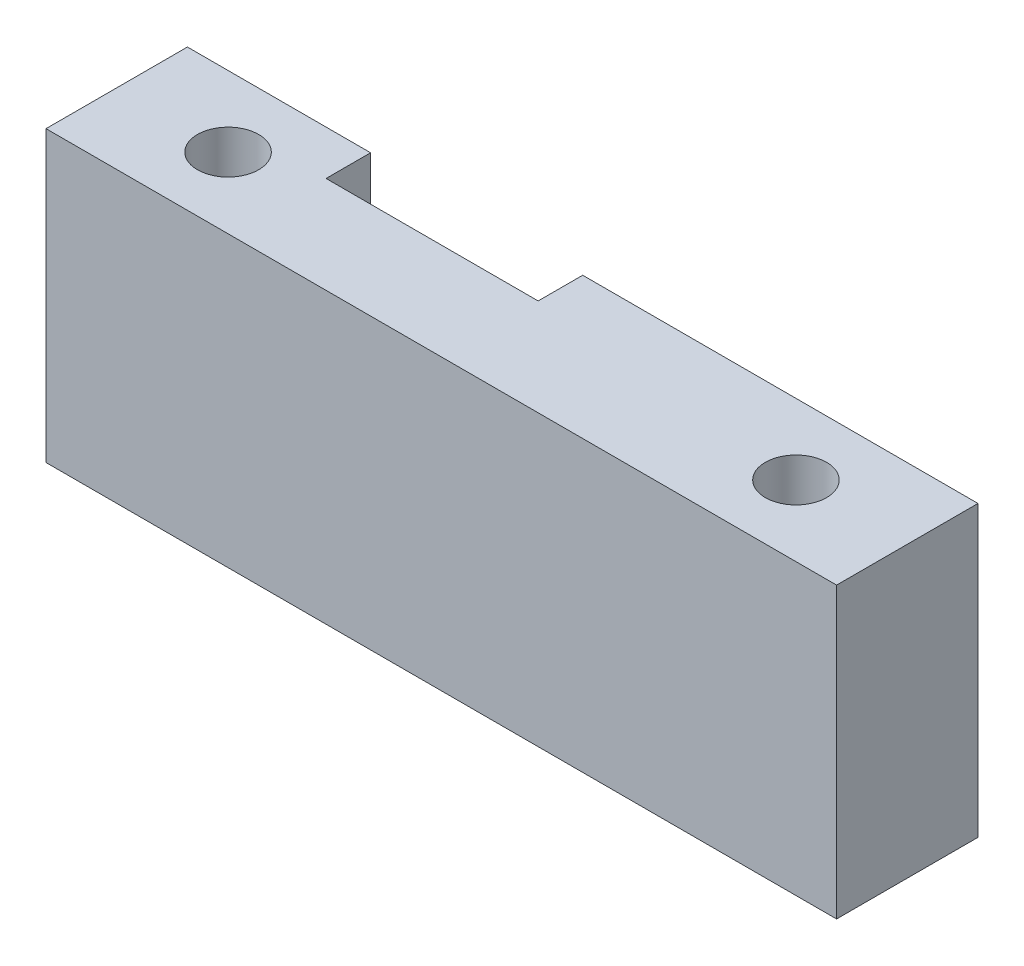
ISO-10303-21;
HEADER;
FILE_DESCRIPTION(('STEP AP214'),'2;1');
FILE_NAME('part.step','',(''),(''),'','','');
FILE_SCHEMA(('AUTOMOTIVE_DESIGN { 1 0 10303 214 1 1 1 1 }'));
ENDSEC;
DATA;
#1=APPLICATION_CONTEXT('core data for automotive mechanical design processes');
#2=APPLICATION_PROTOCOL_DEFINITION('international standard','automotive_design',2000,#1);
#3=PRODUCT_CONTEXT('',#1,'mechanical');
#4=PRODUCT('Part','Part','',(#3));
#5=PRODUCT_RELATED_PRODUCT_CATEGORY('part','',(#4));
#6=PRODUCT_DEFINITION_FORMATION('','',#4);
#7=PRODUCT_DEFINITION_CONTEXT('part definition',#1,'design');
#8=PRODUCT_DEFINITION('design','',#6,#7);
#9=PRODUCT_DEFINITION_SHAPE('','',#8);
#10=(LENGTH_UNIT() NAMED_UNIT(*) SI_UNIT(.MILLI.,.METRE.));
#11=(NAMED_UNIT(*) PLANE_ANGLE_UNIT() SI_UNIT($,.RADIAN.));
#12=(NAMED_UNIT(*) SI_UNIT($,.STERADIAN.) SOLID_ANGLE_UNIT());
#13=UNCERTAINTY_MEASURE_WITH_UNIT(LENGTH_MEASURE(1.E-05),#10,'distance_accuracy_value','');
#14=(GEOMETRIC_REPRESENTATION_CONTEXT(3) GLOBAL_UNCERTAINTY_ASSIGNED_CONTEXT((#13)) GLOBAL_UNIT_ASSIGNED_CONTEXT((#10,
#11,#12)) REPRESENTATION_CONTEXT('',''));
#15=CARTESIAN_POINT('',(0.,0.,0.));
#16=DIRECTION('',(0.,0.,1.));
#17=DIRECTION('',(1.,0.,0.));
#18=AXIS2_PLACEMENT_3D('',#15,#16,#17);
#19=CARTESIAN_POINT('',(-10.,25.97,-6.35));
#20=DIRECTION('',(0.,0.,1.));
#21=DIRECTION('',(1.,0.,0.));
#22=AXIS2_PLACEMENT_3D('',#19,#20,#21);
#23=PLANE('',#22);
#24=DIRECTION('',(-1.,0.,0.));
#25=VECTOR('',#24,1.);
#26=CARTESIAN_POINT('',(-10.,25.97,-6.35));
#27=LINE('',#26,#25);
#28=CARTESIAN_POINT('',(6.45,25.97,-6.35));
#29=VERTEX_POINT('',#28);
#30=CARTESIAN_POINT('',(-10.,25.97,-6.35));
#31=VERTEX_POINT('',#30);
#32=EDGE_CURVE('E71',#29,#31,#27,.T.);
#33=ORIENTED_EDGE('',*,*,#32,.F.);
#34=DIRECTION('',(0.,1.,0.));
#35=VECTOR('',#34,1.);
#36=CARTESIAN_POINT('',(6.45,25.97,-6.35));
#37=LINE('',#36,#35);
#38=CARTESIAN_POINT('',(6.45,0.,-6.35));
#39=VERTEX_POINT('',#38);
#40=EDGE_CURVE('E125',#39,#29,#37,.T.);
#41=ORIENTED_EDGE('',*,*,#40,.F.);
#42=DIRECTION('',(-1.,0.,0.));
#43=VECTOR('',#42,1.);
#44=CARTESIAN_POINT('',(-10.,0.,-6.35));
#45=LINE('',#44,#43);
#46=CARTESIAN_POINT('',(-10.,0.,-6.35));
#47=VERTEX_POINT('',#46);
#48=EDGE_CURVE('E93',#39,#47,#45,.T.);
#49=ORIENTED_EDGE('',*,*,#48,.T.);
#50=DIRECTION('',(0.,-1.,0.));
#51=VECTOR('',#50,1.);
#52=CARTESIAN_POINT('',(-10.,25.97,-6.35));
#53=LINE('',#52,#51);
#54=EDGE_CURVE('E175',#31,#47,#53,.T.);
#55=ORIENTED_EDGE('',*,*,#54,.F.);
#56=EDGE_LOOP('',(#33,#41,#49,#55));
#57=FACE_BOUND('',#56,.T.);
#58=ADVANCED_FACE('F47',(#57),#23,.F.);
#59=CARTESIAN_POINT('',(0.,25.97,0.));
#60=DIRECTION('',(0.,1.,0.));
#61=DIRECTION('',(0.,0.,1.));
#62=AXIS2_PLACEMENT_3D('',#59,#60,#61);
#63=PLANE('',#62);
#64=DIRECTION('',(0.,0.,-1.));
#65=VECTOR('',#64,1.);
#66=CARTESIAN_POINT('',(6.45,25.97,-2.35));
#67=LINE('',#66,#65);
#68=CARTESIAN_POINT('',(6.45,25.97,-2.35));
#69=VERTEX_POINT('',#68);
#70=EDGE_CURVE('E120',#69,#29,#67,.T.);
#71=ORIENTED_EDGE('',*,*,#70,.T.);
#72=ORIENTED_EDGE('',*,*,#32,.T.);
#73=DIRECTION('',(0.,0.,1.));
#74=VECTOR('',#73,1.);
#75=CARTESIAN_POINT('',(-10.,25.97,-6.35));
#76=LINE('',#75,#74);
#77=CARTESIAN_POINT('',(-10.,25.97,6.35));
#78=VERTEX_POINT('',#77);
#79=EDGE_CURVE('E167',#31,#78,#76,.T.);
#80=ORIENTED_EDGE('',*,*,#79,.T.);
#81=DIRECTION('',(1.,0.,0.));
#82=VECTOR('',#81,1.);
#83=CARTESIAN_POINT('',(-10.,25.97,6.35));
#84=LINE('',#83,#82);
#85=CARTESIAN_POINT('',(61.,25.97,6.35));
#86=VERTEX_POINT('',#85);
#87=EDGE_CURVE('E100',#78,#86,#84,.T.);
#88=ORIENTED_EDGE('',*,*,#87,.T.);
#89=DIRECTION('',(0.,0.,-1.));
#90=VECTOR('',#89,1.);
#91=CARTESIAN_POINT('',(61.,25.97,-6.35));
#92=LINE('',#91,#90);
#93=CARTESIAN_POINT('',(61.,25.97,-6.35));
#94=VERTEX_POINT('',#93);
#95=EDGE_CURVE('E171',#86,#94,#92,.T.);
#96=ORIENTED_EDGE('',*,*,#95,.T.);
#97=CARTESIAN_POINT('',(25.5,25.97,-6.35));
#98=VERTEX_POINT('',#97);
#99=EDGE_CURVE('E173',#94,#98,#27,.T.);
#100=ORIENTED_EDGE('',*,*,#99,.T.);
#101=DIRECTION('',(0.,0.,-1.));
#102=VECTOR('',#101,1.);
#103=CARTESIAN_POINT('',(25.5,25.97,-2.35));
#104=LINE('',#103,#102);
#105=CARTESIAN_POINT('',(25.5,25.97,-2.35));
#106=VERTEX_POINT('',#105);
#107=EDGE_CURVE('E62',#106,#98,#104,.T.);
#108=ORIENTED_EDGE('',*,*,#107,.F.);
#109=DIRECTION('',(1.,0.,0.));
#110=VECTOR('',#109,1.);
#111=CARTESIAN_POINT('',(25.5,25.97,-2.35));
#112=LINE('',#111,#110);
#113=EDGE_CURVE('E133',#69,#106,#112,.T.);
#114=ORIENTED_EDGE('',*,*,#113,.F.);
#115=EDGE_LOOP('',(#71,#72,#80,#88,#96,#100,#108,#114));
#116=FACE_BOUND('',#115,.T.);
#117=CARTESIAN_POINT('',(0.,25.97,0.));
#118=DIRECTION('',(0.,1.,0.));
#119=DIRECTION('',(0.,0.,1.));
#120=AXIS2_PLACEMENT_3D('',#117,#118,#119);
#121=CIRCLE('',#120,2.75);
#122=CARTESIAN_POINT('',(0.,25.97,2.75));
#123=VERTEX_POINT('',#122);
#124=EDGE_CURVE('E161',#123,#123,#121,.T.);
#125=ORIENTED_EDGE('',*,*,#124,.F.);
#126=EDGE_LOOP('',(#125));
#127=FACE_BOUND('',#126,.T.);
#128=CARTESIAN_POINT('',(51.,25.97,0.));
#129=DIRECTION('',(0.,1.,0.));
#130=DIRECTION('',(0.,0.,-1.));
#131=AXIS2_PLACEMENT_3D('',#128,#129,#130);
#132=CIRCLE('',#131,2.75);
#133=CARTESIAN_POINT('',(51.,25.97,-2.75));
#134=VERTEX_POINT('',#133);
#135=EDGE_CURVE('E155',#134,#134,#132,.T.);
#136=ORIENTED_EDGE('',*,*,#135,.F.);
#137=EDGE_LOOP('',(#136));
#138=FACE_BOUND('',#137,.T.);
#139=ADVANCED_FACE('F138',(#116,#127,#138),#63,.T.);
#140=CARTESIAN_POINT('',(0.,0.,0.));
#141=DIRECTION('',(0.,1.,0.));
#142=DIRECTION('',(0.,0.,1.));
#143=AXIS2_PLACEMENT_3D('',#140,#141,#142);
#144=PLANE('',#143);
#145=ORIENTED_EDGE('',*,*,#48,.F.);
#146=DIRECTION('',(0.,0.,-1.));
#147=VECTOR('',#146,1.);
#148=CARTESIAN_POINT('',(6.45,0.,-2.35));
#149=LINE('',#148,#147);
#150=CARTESIAN_POINT('',(6.45,0.,-2.35));
#151=VERTEX_POINT('',#150);
#152=EDGE_CURVE('E148',#151,#39,#149,.T.);
#153=ORIENTED_EDGE('',*,*,#152,.F.);
#154=DIRECTION('',(-1.,0.,0.));
#155=VECTOR('',#154,1.);
#156=CARTESIAN_POINT('',(25.5,0.,-2.35));
#157=LINE('',#156,#155);
#158=CARTESIAN_POINT('',(25.5,0.,-2.35));
#159=VERTEX_POINT('',#158);
#160=EDGE_CURVE('E127',#159,#151,#157,.T.);
#161=ORIENTED_EDGE('',*,*,#160,.F.);
#162=DIRECTION('',(0.,0.,-1.));
#163=VECTOR('',#162,1.);
#164=CARTESIAN_POINT('',(25.5,0.,-2.35));
#165=LINE('',#164,#163);
#166=CARTESIAN_POINT('',(25.5,0.,-6.35));
#167=VERTEX_POINT('',#166);
#168=EDGE_CURVE('E151',#159,#167,#165,.T.);
#169=ORIENTED_EDGE('',*,*,#168,.T.);
#170=CARTESIAN_POINT('',(61.,0.,-6.35));
#171=VERTEX_POINT('',#170);
#172=EDGE_CURVE('E169',#171,#167,#45,.T.);
#173=ORIENTED_EDGE('',*,*,#172,.F.);
#174=DIRECTION('',(0.,0.,-1.));
#175=VECTOR('',#174,1.);
#176=CARTESIAN_POINT('',(61.,0.,-6.35));
#177=LINE('',#176,#175);
#178=CARTESIAN_POINT('',(61.,0.,6.35));
#179=VERTEX_POINT('',#178);
#180=EDGE_CURVE('E180',#179,#171,#177,.T.);
#181=ORIENTED_EDGE('',*,*,#180,.F.);
#182=DIRECTION('',(1.,0.,0.));
#183=VECTOR('',#182,1.);
#184=CARTESIAN_POINT('',(-10.,0.,6.35));
#185=LINE('',#184,#183);
#186=CARTESIAN_POINT('',(-10.,0.,6.35));
#187=VERTEX_POINT('',#186);
#188=EDGE_CURVE('E178',#187,#179,#185,.T.);
#189=ORIENTED_EDGE('',*,*,#188,.F.);
#190=DIRECTION('',(0.,0.,1.));
#191=VECTOR('',#190,1.);
#192=CARTESIAN_POINT('',(-10.,0.,-6.35));
#193=LINE('',#192,#191);
#194=EDGE_CURVE('E164',#47,#187,#193,.T.);
#195=ORIENTED_EDGE('',*,*,#194,.F.);
#196=EDGE_LOOP('',(#145,#153,#161,#169,#173,#181,#189,#195));
#197=FACE_BOUND('',#196,.T.);
#198=CARTESIAN_POINT('',(0.,0.,0.));
#199=DIRECTION('',(0.,1.,0.));
#200=DIRECTION('',(0.,0.,1.));
#201=AXIS2_PLACEMENT_3D('',#198,#199,#200);
#202=CIRCLE('',#201,2.75);
#203=CARTESIAN_POINT('',(0.,0.,2.75));
#204=VERTEX_POINT('',#203);
#205=EDGE_CURVE('E158',#204,#204,#202,.T.);
#206=ORIENTED_EDGE('',*,*,#205,.T.);
#207=EDGE_LOOP('',(#206));
#208=FACE_BOUND('',#207,.T.);
#209=CARTESIAN_POINT('',(51.,0.,0.));
#210=DIRECTION('',(0.,1.,0.));
#211=DIRECTION('',(0.,0.,-1.));
#212=AXIS2_PLACEMENT_3D('',#209,#210,#211);
#213=CIRCLE('',#212,2.75);
#214=CARTESIAN_POINT('',(51.,0.,-2.75));
#215=VERTEX_POINT('',#214);
#216=EDGE_CURVE('E150',#215,#215,#213,.T.);
#217=ORIENTED_EDGE('',*,*,#216,.T.);
#218=EDGE_LOOP('',(#217));
#219=FACE_BOUND('',#218,.T.);
#220=ADVANCED_FACE('F195',(#197,#208,#219),#144,.F.);
#221=CARTESIAN_POINT('',(-10.,25.97,-6.35));
#222=DIRECTION('',(1.,0.,0.));
#223=DIRECTION('',(0.,0.,-1.));
#224=AXIS2_PLACEMENT_3D('',#221,#222,#223);
#225=PLANE('',#224);
#226=ORIENTED_EDGE('',*,*,#194,.T.);
#227=DIRECTION('',(0.,-1.,0.));
#228=VECTOR('',#227,1.);
#229=CARTESIAN_POINT('',(-10.,25.97,6.35));
#230=LINE('',#229,#228);
#231=EDGE_CURVE('E11',#78,#187,#230,.T.);
#232=ORIENTED_EDGE('',*,*,#231,.F.);
#233=ORIENTED_EDGE('',*,*,#79,.F.);
#234=ORIENTED_EDGE('',*,*,#54,.T.);
#235=EDGE_LOOP('',(#226,#232,#233,#234));
#236=FACE_BOUND('',#235,.T.);
#237=ADVANCED_FACE('F49',(#236),#225,.F.);
#238=CARTESIAN_POINT('',(-10.,25.97,6.35));
#239=DIRECTION('',(0.,0.,-1.));
#240=DIRECTION('',(-1.,0.,0.));
#241=AXIS2_PLACEMENT_3D('',#238,#239,#240);
#242=PLANE('',#241);
#243=ORIENTED_EDGE('',*,*,#188,.T.);
#244=DIRECTION('',(0.,-1.,0.));
#245=VECTOR('',#244,1.);
#246=CARTESIAN_POINT('',(61.,25.97,6.35));
#247=LINE('',#246,#245);
#248=EDGE_CURVE('E55',#86,#179,#247,.T.);
#249=ORIENTED_EDGE('',*,*,#248,.F.);
#250=ORIENTED_EDGE('',*,*,#87,.F.);
#251=ORIENTED_EDGE('',*,*,#231,.T.);
#252=EDGE_LOOP('',(#243,#249,#250,#251));
#253=FACE_BOUND('',#252,.T.);
#254=ADVANCED_FACE('F204',(#253),#242,.F.);
#255=CARTESIAN_POINT('',(61.,25.97,-6.35));
#256=DIRECTION('',(-1.,0.,0.));
#257=DIRECTION('',(0.,0.,1.));
#258=AXIS2_PLACEMENT_3D('',#255,#256,#257);
#259=PLANE('',#258);
#260=ORIENTED_EDGE('',*,*,#180,.T.);
#261=DIRECTION('',(0.,-1.,0.));
#262=VECTOR('',#261,1.);
#263=CARTESIAN_POINT('',(61.,25.97,-6.35));
#264=LINE('',#263,#262);
#265=EDGE_CURVE('E185',#94,#171,#264,.T.);
#266=ORIENTED_EDGE('',*,*,#265,.F.);
#267=ORIENTED_EDGE('',*,*,#95,.F.);
#268=ORIENTED_EDGE('',*,*,#248,.T.);
#269=EDGE_LOOP('',(#260,#266,#267,#268));
#270=FACE_BOUND('',#269,.T.);
#271=ADVANCED_FACE('F191',(#270),#259,.F.);
#272=ORIENTED_EDGE('',*,*,#172,.T.);
#273=DIRECTION('',(0.,-1.,0.));
#274=VECTOR('',#273,1.);
#275=CARTESIAN_POINT('',(25.5,25.97,-6.35));
#276=LINE('',#275,#274);
#277=EDGE_CURVE('E136',#98,#167,#276,.T.);
#278=ORIENTED_EDGE('',*,*,#277,.F.);
#279=ORIENTED_EDGE('',*,*,#99,.F.);
#280=ORIENTED_EDGE('',*,*,#265,.T.);
#281=EDGE_LOOP('',(#272,#278,#279,#280));
#282=FACE_BOUND('',#281,.T.);
#283=ADVANCED_FACE('F199',(#282),#23,.F.);
#284=CARTESIAN_POINT('',(0.,25.97,0.));
#285=DIRECTION('',(0.,-1.,0.));
#286=DIRECTION('',(0.,0.,-1.));
#287=AXIS2_PLACEMENT_3D('',#284,#285,#286);
#288=CYLINDRICAL_SURFACE('',#287,2.75);
#289=ORIENTED_EDGE('',*,*,#124,.T.);
#290=EDGE_LOOP('',(#289));
#291=FACE_BOUND('',#290,.T.);
#292=ORIENTED_EDGE('',*,*,#205,.F.);
#293=EDGE_LOOP('',(#292));
#294=FACE_BOUND('',#293,.T.);
#295=ADVANCED_FACE('F220',(#291,#294),#288,.F.);
#296=CARTESIAN_POINT('',(51.,25.97,0.));
#297=DIRECTION('',(0.,-1.,0.));
#298=DIRECTION('',(0.,0.,-1.));
#299=AXIS2_PLACEMENT_3D('',#296,#297,#298);
#300=CYLINDRICAL_SURFACE('',#299,2.75);
#301=ORIENTED_EDGE('',*,*,#135,.T.);
#302=EDGE_LOOP('',(#301));
#303=FACE_BOUND('',#302,.T.);
#304=ORIENTED_EDGE('',*,*,#216,.F.);
#305=EDGE_LOOP('',(#304));
#306=FACE_BOUND('',#305,.T.);
#307=ADVANCED_FACE('F226',(#303,#306),#300,.F.);
#308=CARTESIAN_POINT('',(6.45,25.97,-2.35));
#309=DIRECTION('',(-1.,0.,0.));
#310=DIRECTION('',(0.,0.,1.));
#311=AXIS2_PLACEMENT_3D('',#308,#309,#310);
#312=PLANE('',#311);
#313=ORIENTED_EDGE('',*,*,#40,.T.);
#314=ORIENTED_EDGE('',*,*,#70,.F.);
#315=DIRECTION('',(0.,1.,0.));
#316=VECTOR('',#315,1.);
#317=CARTESIAN_POINT('',(6.45,25.97,-2.35));
#318=LINE('',#317,#316);
#319=EDGE_CURVE('E123',#151,#69,#318,.T.);
#320=ORIENTED_EDGE('',*,*,#319,.F.);
#321=ORIENTED_EDGE('',*,*,#152,.T.);
#322=EDGE_LOOP('',(#313,#314,#320,#321));
#323=FACE_BOUND('',#322,.T.);
#324=ADVANCED_FACE('F122',(#323),#312,.F.);
#325=CARTESIAN_POINT('',(25.5,25.97,-2.35));
#326=DIRECTION('',(1.,0.,0.));
#327=DIRECTION('',(0.,1.,0.));
#328=AXIS2_PLACEMENT_3D('',#325,#326,#327);
#329=PLANE('',#328);
#330=ORIENTED_EDGE('',*,*,#277,.T.);
#331=ORIENTED_EDGE('',*,*,#168,.F.);
#332=DIRECTION('',(0.,-1.,0.));
#333=VECTOR('',#332,1.);
#334=CARTESIAN_POINT('',(25.5,25.97,-2.35));
#335=LINE('',#334,#333);
#336=EDGE_CURVE('E141',#106,#159,#335,.T.);
#337=ORIENTED_EDGE('',*,*,#336,.F.);
#338=ORIENTED_EDGE('',*,*,#107,.T.);
#339=EDGE_LOOP('',(#330,#331,#337,#338));
#340=FACE_BOUND('',#339,.T.);
#341=ADVANCED_FACE('F282',(#340),#329,.F.);
#342=CARTESIAN_POINT('',(0.,0.,-2.35));
#343=DIRECTION('',(0.,0.,-1.));
#344=DIRECTION('',(-1.,0.,0.));
#345=AXIS2_PLACEMENT_3D('',#342,#343,#344);
#346=PLANE('',#345);
#347=ORIENTED_EDGE('',*,*,#319,.T.);
#348=ORIENTED_EDGE('',*,*,#113,.T.);
#349=ORIENTED_EDGE('',*,*,#336,.T.);
#350=ORIENTED_EDGE('',*,*,#160,.T.);
#351=EDGE_LOOP('',(#347,#348,#349,#350));
#352=FACE_BOUND('',#351,.T.);
#353=ADVANCED_FACE('F131',(#352),#346,.T.);
#354=CLOSED_SHELL('',(#58,#139,#220,#237,#254,#271,#283,#295,#307,#324,#341,#353));
#355=MANIFOLD_SOLID_BREP('B2',#354);
#356=ADVANCED_BREP_SHAPE_REPRESENTATION('',(#18,#355),#14);
#357=SHAPE_DEFINITION_REPRESENTATION(#9,#356);
ENDSEC;
END-ISO-10303-21;
